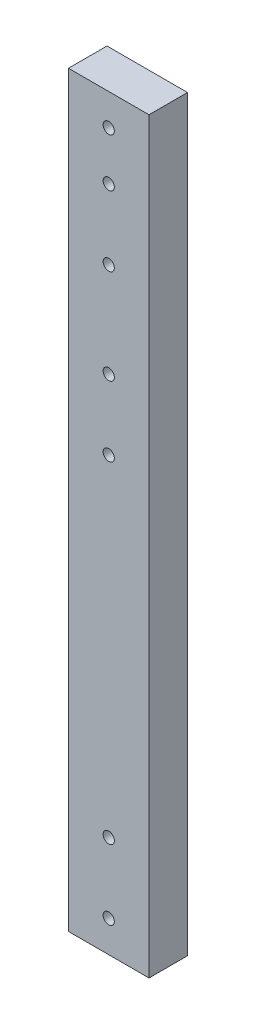
ISO-10303-21;
HEADER;
FILE_DESCRIPTION(('STEP AP214'),'2;1');
FILE_NAME('part.step','',(''),(''),'','','');
FILE_SCHEMA(('AUTOMOTIVE_DESIGN { 1 0 10303 214 1 1 1 1 }'));
ENDSEC;
DATA;
#1=APPLICATION_CONTEXT('core data for automotive mechanical design processes');
#2=APPLICATION_PROTOCOL_DEFINITION('international standard','automotive_design',2000,#1);
#3=PRODUCT_CONTEXT('',#1,'mechanical');
#4=PRODUCT('Part','Part','',(#3));
#5=PRODUCT_RELATED_PRODUCT_CATEGORY('part','',(#4));
#6=PRODUCT_DEFINITION_FORMATION('','',#4);
#7=PRODUCT_DEFINITION_CONTEXT('part definition',#1,'design');
#8=PRODUCT_DEFINITION('design','',#6,#7);
#9=PRODUCT_DEFINITION_SHAPE('','',#8);
#10=(LENGTH_UNIT() NAMED_UNIT(*) SI_UNIT(.MILLI.,.METRE.));
#11=(NAMED_UNIT(*) PLANE_ANGLE_UNIT() SI_UNIT($,.RADIAN.));
#12=(NAMED_UNIT(*) SI_UNIT($,.STERADIAN.) SOLID_ANGLE_UNIT());
#13=UNCERTAINTY_MEASURE_WITH_UNIT(LENGTH_MEASURE(1.E-05),#10,'distance_accuracy_value','');
#14=(GEOMETRIC_REPRESENTATION_CONTEXT(3) GLOBAL_UNCERTAINTY_ASSIGNED_CONTEXT((#13)) GLOBAL_UNIT_ASSIGNED_CONTEXT((#10,
#11,#12)) REPRESENTATION_CONTEXT('',''));
#15=CARTESIAN_POINT('',(0.,0.,0.));
#16=DIRECTION('',(0.,0.,1.));
#17=DIRECTION('',(1.,0.,0.));
#18=AXIS2_PLACEMENT_3D('',#15,#16,#17);
#19=CARTESIAN_POINT('',(0.,0.,9.));
#20=DIRECTION('',(0.,0.,1.));
#21=DIRECTION('',(1.,0.,0.));
#22=AXIS2_PLACEMENT_3D('',#19,#20,#21);
#23=PLANE('',#22);
#24=CARTESIAN_POINT('',(0.,29.6000000000001,9.));
#25=DIRECTION('',(0.,0.,1.));
#26=DIRECTION('',(1.,0.,0.));
#27=AXIS2_PLACEMENT_3D('',#24,#25,#26);
#28=CIRCLE('',#27,1.6);
#29=CARTESIAN_POINT('',(1.60000000000003,29.6000000000001,9.));
#30=VERTEX_POINT('',#29);
#31=EDGE_CURVE('E195',#30,#30,#28,.T.);
#32=ORIENTED_EDGE('',*,*,#31,.F.);
#33=EDGE_LOOP('',(#32));
#34=FACE_BOUND('',#33,.T.);
#35=CARTESIAN_POINT('',(0.,76.66,9.));
#36=DIRECTION('',(0.,0.,1.));
#37=DIRECTION('',(1.,0.,0.));
#38=AXIS2_PLACEMENT_3D('',#35,#36,#37);
#39=CIRCLE('',#38,1.6);
#40=CARTESIAN_POINT('',(1.6,76.66,9.));
#41=VERTEX_POINT('',#40);
#42=EDGE_CURVE('E211',#41,#41,#39,.T.);
#43=ORIENTED_EDGE('',*,*,#42,.F.);
#44=EDGE_LOOP('',(#43));
#45=FACE_BOUND('',#44,.T.);
#46=CARTESIAN_POINT('',(0.,-85.,9.));
#47=DIRECTION('',(0.,0.,1.));
#48=DIRECTION('',(1.,0.,0.));
#49=AXIS2_PLACEMENT_3D('',#46,#47,#48);
#50=CIRCLE('',#49,1.60000000000001);
#51=CARTESIAN_POINT('',(1.60000000000001,-85.,9.));
#52=VERTEX_POINT('',#51);
#53=EDGE_CURVE('E227',#52,#52,#50,.T.);
#54=ORIENTED_EDGE('',*,*,#53,.F.);
#55=EDGE_LOOP('',(#54));
#56=FACE_BOUND('',#55,.T.);
#57=DIRECTION('',(0.,1.,0.));
#58=VECTOR('',#57,1.);
#59=CARTESIAN_POINT('',(11.5,-114.,9.));
#60=LINE('',#59,#58);
#61=CARTESIAN_POINT('',(11.5,-114.,9.));
#62=VERTEX_POINT('',#61);
#63=CARTESIAN_POINT('',(11.5,99.5,9.));
#64=VERTEX_POINT('',#63);
#65=EDGE_CURVE('E239',#62,#64,#60,.T.);
#66=ORIENTED_EDGE('',*,*,#65,.T.);
#67=DIRECTION('',(-1.,0.,0.));
#68=VECTOR('',#67,1.);
#69=CARTESIAN_POINT('',(11.5,99.5,9.));
#70=LINE('',#69,#68);
#71=CARTESIAN_POINT('',(-11.5,99.5,9.));
#72=VERTEX_POINT('',#71);
#73=EDGE_CURVE('E246',#64,#72,#70,.T.);
#74=ORIENTED_EDGE('',*,*,#73,.T.);
#75=DIRECTION('',(0.,-1.,0.));
#76=VECTOR('',#75,1.);
#77=CARTESIAN_POINT('',(-11.5,99.5,9.));
#78=LINE('',#77,#76);
#79=CARTESIAN_POINT('',(-11.5,-114.,9.));
#80=VERTEX_POINT('',#79);
#81=EDGE_CURVE('E249',#72,#80,#78,.T.);
#82=ORIENTED_EDGE('',*,*,#81,.T.);
#83=DIRECTION('',(1.,0.,0.));
#84=VECTOR('',#83,1.);
#85=CARTESIAN_POINT('',(-11.5,-114.,9.));
#86=LINE('',#85,#84);
#87=EDGE_CURVE('E252',#80,#62,#86,.T.);
#88=ORIENTED_EDGE('',*,*,#87,.T.);
#89=EDGE_LOOP('',(#66,#74,#82,#88));
#90=FACE_BOUND('',#89,.T.);
#91=CARTESIAN_POINT('',(0.,-105.,9.));
#92=DIRECTION('',(0.,0.,1.));
#93=DIRECTION('',(1.,0.,0.));
#94=AXIS2_PLACEMENT_3D('',#91,#92,#93);
#95=CIRCLE('',#94,1.60000000000001);
#96=CARTESIAN_POINT('',(1.60000000000001,-105.,9.));
#97=VERTEX_POINT('',#96);
#98=EDGE_CURVE('E235',#97,#97,#95,.T.);
#99=ORIENTED_EDGE('',*,*,#98,.F.);
#100=EDGE_LOOP('',(#99));
#101=FACE_BOUND('',#100,.T.);
#102=CARTESIAN_POINT('',(0.,90.5,9.));
#103=DIRECTION('',(0.,0.,1.));
#104=DIRECTION('',(1.,0.,0.));
#105=AXIS2_PLACEMENT_3D('',#102,#103,#104);
#106=CIRCLE('',#105,1.6);
#107=CARTESIAN_POINT('',(1.6,90.5,9.));
#108=VERTEX_POINT('',#107);
#109=EDGE_CURVE('E219',#108,#108,#106,.T.);
#110=ORIENTED_EDGE('',*,*,#109,.F.);
#111=EDGE_LOOP('',(#110));
#112=FACE_BOUND('',#111,.T.);
#113=CARTESIAN_POINT('',(0.,56.66,9.));
#114=DIRECTION('',(0.,0.,1.));
#115=DIRECTION('',(1.,0.,0.));
#116=AXIS2_PLACEMENT_3D('',#113,#114,#115);
#117=CIRCLE('',#116,1.6);
#118=CARTESIAN_POINT('',(1.6,56.66,9.));
#119=VERTEX_POINT('',#118);
#120=EDGE_CURVE('E203',#119,#119,#117,.T.);
#121=ORIENTED_EDGE('',*,*,#120,.F.);
#122=EDGE_LOOP('',(#121));
#123=FACE_BOUND('',#122,.T.);
#124=CARTESIAN_POINT('',(0.,9.60000000000005,9.));
#125=DIRECTION('',(0.,0.,1.));
#126=DIRECTION('',(1.,0.,0.));
#127=AXIS2_PLACEMENT_3D('',#124,#125,#126);
#128=CIRCLE('',#127,1.6);
#129=CARTESIAN_POINT('',(1.60000000000005,9.60000000000005,9.));
#130=VERTEX_POINT('',#129);
#131=EDGE_CURVE('E187',#130,#130,#128,.T.);
#132=ORIENTED_EDGE('',*,*,#131,.F.);
#133=EDGE_LOOP('',(#132));
#134=FACE_BOUND('',#133,.T.);
#135=ADVANCED_FACE('F47',(#34,#45,#56,#90,#101,#112,#123,#134),#23,.T.);
#136=CARTESIAN_POINT('',(0.,0.,5.));
#137=DIRECTION('',(0.,0.,1.));
#138=DIRECTION('',(1.,0.,0.));
#139=AXIS2_PLACEMENT_3D('',#136,#137,#138);
#140=PLANE('',#139);
#141=DIRECTION('',(0.,-1.,0.));
#142=VECTOR('',#141,1.);
#143=CARTESIAN_POINT('',(7.65,95.65,5.));
#144=LINE('',#143,#142);
#145=CARTESIAN_POINT('',(7.65,95.65,5.));
#146=VERTEX_POINT('',#145);
#147=CARTESIAN_POINT('',(7.65,-110.15,5.));
#148=VERTEX_POINT('',#147);
#149=EDGE_CURVE('E152',#146,#148,#144,.T.);
#150=ORIENTED_EDGE('',*,*,#149,.T.);
#151=DIRECTION('',(-1.,0.,0.));
#152=VECTOR('',#151,1.);
#153=CARTESIAN_POINT('',(7.65,-110.15,5.));
#154=LINE('',#153,#152);
#155=CARTESIAN_POINT('',(-7.65,-110.15,5.));
#156=VERTEX_POINT('',#155);
#157=EDGE_CURVE('E132',#148,#156,#154,.T.);
#158=ORIENTED_EDGE('',*,*,#157,.T.);
#159=DIRECTION('',(0.,1.,0.));
#160=VECTOR('',#159,1.);
#161=CARTESIAN_POINT('',(-7.65,-110.15,5.));
#162=LINE('',#161,#160);
#163=CARTESIAN_POINT('',(-7.65,95.65,5.));
#164=VERTEX_POINT('',#163);
#165=EDGE_CURVE('E141',#156,#164,#162,.T.);
#166=ORIENTED_EDGE('',*,*,#165,.T.);
#167=DIRECTION('',(1.,0.,0.));
#168=VECTOR('',#167,1.);
#169=CARTESIAN_POINT('',(-7.65,95.65,5.));
#170=LINE('',#169,#168);
#171=EDGE_CURVE('E147',#164,#146,#170,.T.);
#172=ORIENTED_EDGE('',*,*,#171,.T.);
#173=EDGE_LOOP('',(#150,#158,#166,#172));
#174=FACE_BOUND('',#173,.T.);
#175=CARTESIAN_POINT('',(0.,-105.,5.));
#176=DIRECTION('',(0.,0.,1.));
#177=DIRECTION('',(1.,0.,0.));
#178=AXIS2_PLACEMENT_3D('',#175,#176,#177);
#179=CIRCLE('',#178,1.60000000000001);
#180=CARTESIAN_POINT('',(1.60000000000001,-105.,5.));
#181=VERTEX_POINT('',#180);
#182=EDGE_CURVE('E231',#181,#181,#179,.T.);
#183=ORIENTED_EDGE('',*,*,#182,.T.);
#184=EDGE_LOOP('',(#183));
#185=FACE_BOUND('',#184,.T.);
#186=CARTESIAN_POINT('',(0.,-85.,5.));
#187=DIRECTION('',(0.,0.,1.));
#188=DIRECTION('',(1.,0.,0.));
#189=AXIS2_PLACEMENT_3D('',#186,#187,#188);
#190=CIRCLE('',#189,1.60000000000001);
#191=CARTESIAN_POINT('',(1.60000000000001,-85.,5.));
#192=VERTEX_POINT('',#191);
#193=EDGE_CURVE('E223',#192,#192,#190,.T.);
#194=ORIENTED_EDGE('',*,*,#193,.T.);
#195=EDGE_LOOP('',(#194));
#196=FACE_BOUND('',#195,.T.);
#197=CARTESIAN_POINT('',(0.,90.5,5.));
#198=DIRECTION('',(0.,0.,1.));
#199=DIRECTION('',(1.,0.,0.));
#200=AXIS2_PLACEMENT_3D('',#197,#198,#199);
#201=CIRCLE('',#200,1.6);
#202=CARTESIAN_POINT('',(1.6,90.5,5.));
#203=VERTEX_POINT('',#202);
#204=EDGE_CURVE('E215',#203,#203,#201,.T.);
#205=ORIENTED_EDGE('',*,*,#204,.T.);
#206=EDGE_LOOP('',(#205));
#207=FACE_BOUND('',#206,.T.);
#208=CARTESIAN_POINT('',(0.,76.66,5.));
#209=DIRECTION('',(0.,0.,1.));
#210=DIRECTION('',(1.,0.,0.));
#211=AXIS2_PLACEMENT_3D('',#208,#209,#210);
#212=CIRCLE('',#211,1.6);
#213=CARTESIAN_POINT('',(1.6,76.66,5.));
#214=VERTEX_POINT('',#213);
#215=EDGE_CURVE('E207',#214,#214,#212,.T.);
#216=ORIENTED_EDGE('',*,*,#215,.T.);
#217=EDGE_LOOP('',(#216));
#218=FACE_BOUND('',#217,.T.);
#219=CARTESIAN_POINT('',(0.,56.66,5.));
#220=DIRECTION('',(0.,0.,1.));
#221=DIRECTION('',(1.,0.,0.));
#222=AXIS2_PLACEMENT_3D('',#219,#220,#221);
#223=CIRCLE('',#222,1.6);
#224=CARTESIAN_POINT('',(1.6,56.66,5.));
#225=VERTEX_POINT('',#224);
#226=EDGE_CURVE('E199',#225,#225,#223,.T.);
#227=ORIENTED_EDGE('',*,*,#226,.T.);
#228=EDGE_LOOP('',(#227));
#229=FACE_BOUND('',#228,.T.);
#230=CARTESIAN_POINT('',(0.,29.6000000000001,5.));
#231=DIRECTION('',(0.,0.,1.));
#232=DIRECTION('',(1.,0.,0.));
#233=AXIS2_PLACEMENT_3D('',#230,#231,#232);
#234=CIRCLE('',#233,1.6);
#235=CARTESIAN_POINT('',(1.60000000000003,29.6000000000001,5.));
#236=VERTEX_POINT('',#235);
#237=EDGE_CURVE('E191',#236,#236,#234,.T.);
#238=ORIENTED_EDGE('',*,*,#237,.T.);
#239=EDGE_LOOP('',(#238));
#240=FACE_BOUND('',#239,.T.);
#241=CARTESIAN_POINT('',(0.,9.60000000000005,5.));
#242=DIRECTION('',(0.,0.,1.));
#243=DIRECTION('',(1.,0.,0.));
#244=AXIS2_PLACEMENT_3D('',#241,#242,#243);
#245=CIRCLE('',#244,1.6);
#246=CARTESIAN_POINT('',(1.60000000000005,9.60000000000005,5.));
#247=VERTEX_POINT('',#246);
#248=EDGE_CURVE('E186',#247,#247,#245,.T.);
#249=ORIENTED_EDGE('',*,*,#248,.T.);
#250=EDGE_LOOP('',(#249));
#251=FACE_BOUND('',#250,.T.);
#252=ADVANCED_FACE('F149',(#174,#185,#196,#207,#218,#229,#240,#251),#140,.F.);
#253=CARTESIAN_POINT('',(11.5,-114.,9.));
#254=DIRECTION('',(-1.,0.,0.));
#255=DIRECTION('',(0.,0.,1.));
#256=AXIS2_PLACEMENT_3D('',#253,#254,#255);
#257=PLANE('',#256);
#258=DIRECTION('',(0.,0.,-1.));
#259=VECTOR('',#258,1.);
#260=CARTESIAN_POINT('',(11.5,-114.,9.));
#261=LINE('',#260,#259);
#262=CARTESIAN_POINT('',(11.5,-114.,-2.));
#263=VERTEX_POINT('',#262);
#264=EDGE_CURVE('E255',#62,#263,#261,.T.);
#265=ORIENTED_EDGE('',*,*,#264,.T.);
#266=DIRECTION('',(0.,-1.,0.));
#267=VECTOR('',#266,1.);
#268=CARTESIAN_POINT('',(11.5,99.5,-2.));
#269=LINE('',#268,#267);
#270=CARTESIAN_POINT('',(11.5,99.5,-2.));
#271=VERTEX_POINT('',#270);
#272=EDGE_CURVE('E174',#271,#263,#269,.T.);
#273=ORIENTED_EDGE('',*,*,#272,.F.);
#274=DIRECTION('',(0.,0.,-1.));
#275=VECTOR('',#274,1.);
#276=CARTESIAN_POINT('',(11.5,99.5,9.));
#277=LINE('',#276,#275);
#278=EDGE_CURVE('E264',#64,#271,#277,.T.);
#279=ORIENTED_EDGE('',*,*,#278,.F.);
#280=ORIENTED_EDGE('',*,*,#65,.F.);
#281=EDGE_LOOP('',(#265,#273,#279,#280));
#282=FACE_BOUND('',#281,.T.);
#283=ADVANCED_FACE('F324',(#282),#257,.F.);
#284=CARTESIAN_POINT('',(11.5,99.5,9.));
#285=DIRECTION('',(0.,-1.,0.));
#286=DIRECTION('',(0.,0.,-1.));
#287=AXIS2_PLACEMENT_3D('',#284,#285,#286);
#288=PLANE('',#287);
#289=ORIENTED_EDGE('',*,*,#278,.T.);
#290=DIRECTION('',(1.,0.,0.));
#291=VECTOR('',#290,1.);
#292=CARTESIAN_POINT('',(-11.5,99.5,-2.));
#293=LINE('',#292,#291);
#294=CARTESIAN_POINT('',(-11.5,99.5,-2.));
#295=VERTEX_POINT('',#294);
#296=EDGE_CURVE('E137',#295,#271,#293,.T.);
#297=ORIENTED_EDGE('',*,*,#296,.F.);
#298=DIRECTION('',(0.,0.,-1.));
#299=VECTOR('',#298,1.);
#300=CARTESIAN_POINT('',(-11.5,99.5,9.));
#301=LINE('',#300,#299);
#302=EDGE_CURVE('E261',#72,#295,#301,.T.);
#303=ORIENTED_EDGE('',*,*,#302,.F.);
#304=ORIENTED_EDGE('',*,*,#73,.F.);
#305=EDGE_LOOP('',(#289,#297,#303,#304));
#306=FACE_BOUND('',#305,.T.);
#307=ADVANCED_FACE('F339',(#306),#288,.F.);
#308=CARTESIAN_POINT('',(-11.5,99.5,9.));
#309=DIRECTION('',(1.,0.,0.));
#310=DIRECTION('',(0.,0.,-1.));
#311=AXIS2_PLACEMENT_3D('',#308,#309,#310);
#312=PLANE('',#311);
#313=ORIENTED_EDGE('',*,*,#302,.T.);
#314=DIRECTION('',(0.,1.,0.));
#315=VECTOR('',#314,1.);
#316=CARTESIAN_POINT('',(-11.5,-114.,-2.));
#317=LINE('',#316,#315);
#318=CARTESIAN_POINT('',(-11.5,-114.,-2.));
#319=VERTEX_POINT('',#318);
#320=EDGE_CURVE('E182',#319,#295,#317,.T.);
#321=ORIENTED_EDGE('',*,*,#320,.F.);
#322=DIRECTION('',(0.,0.,-1.));
#323=VECTOR('',#322,1.);
#324=CARTESIAN_POINT('',(-11.5,-114.,9.));
#325=LINE('',#324,#323);
#326=EDGE_CURVE('E258',#80,#319,#325,.T.);
#327=ORIENTED_EDGE('',*,*,#326,.F.);
#328=ORIENTED_EDGE('',*,*,#81,.F.);
#329=EDGE_LOOP('',(#313,#321,#327,#328));
#330=FACE_BOUND('',#329,.T.);
#331=ADVANCED_FACE('F335',(#330),#312,.F.);
#332=CARTESIAN_POINT('',(-11.5,-114.,9.));
#333=DIRECTION('',(0.,1.,0.));
#334=DIRECTION('',(0.,0.,1.));
#335=AXIS2_PLACEMENT_3D('',#332,#333,#334);
#336=PLANE('',#335);
#337=ORIENTED_EDGE('',*,*,#326,.T.);
#338=DIRECTION('',(-1.,0.,0.));
#339=VECTOR('',#338,1.);
#340=CARTESIAN_POINT('',(11.5,-114.,-2.));
#341=LINE('',#340,#339);
#342=EDGE_CURVE('E178',#263,#319,#341,.T.);
#343=ORIENTED_EDGE('',*,*,#342,.F.);
#344=ORIENTED_EDGE('',*,*,#264,.F.);
#345=ORIENTED_EDGE('',*,*,#87,.F.);
#346=EDGE_LOOP('',(#337,#343,#344,#345));
#347=FACE_BOUND('',#346,.T.);
#348=ADVANCED_FACE('F332',(#347),#336,.F.);
#349=CARTESIAN_POINT('',(0.,-105.,9.));
#350=DIRECTION('',(0.,0.,-1.));
#351=DIRECTION('',(-1.,0.,0.));
#352=AXIS2_PLACEMENT_3D('',#349,#350,#351);
#353=CYLINDRICAL_SURFACE('',#352,1.60000000000001);
#354=ORIENTED_EDGE('',*,*,#98,.T.);
#355=EDGE_LOOP('',(#354));
#356=FACE_BOUND('',#355,.T.);
#357=ORIENTED_EDGE('',*,*,#182,.F.);
#358=EDGE_LOOP('',(#357));
#359=FACE_BOUND('',#358,.T.);
#360=ADVANCED_FACE('F329',(#356,#359),#353,.F.);
#361=CARTESIAN_POINT('',(0.,-85.,9.));
#362=DIRECTION('',(0.,0.,-1.));
#363=DIRECTION('',(-1.,0.,0.));
#364=AXIS2_PLACEMENT_3D('',#361,#362,#363);
#365=CYLINDRICAL_SURFACE('',#364,1.60000000000001);
#366=ORIENTED_EDGE('',*,*,#53,.T.);
#367=EDGE_LOOP('',(#366));
#368=FACE_BOUND('',#367,.T.);
#369=ORIENTED_EDGE('',*,*,#193,.F.);
#370=EDGE_LOOP('',(#369));
#371=FACE_BOUND('',#370,.T.);
#372=ADVANCED_FACE('F485',(#368,#371),#365,.F.);
#373=CARTESIAN_POINT('',(0.,90.5,9.));
#374=DIRECTION('',(0.,0.,-1.));
#375=DIRECTION('',(-1.,0.,0.));
#376=AXIS2_PLACEMENT_3D('',#373,#374,#375);
#377=CYLINDRICAL_SURFACE('',#376,1.6);
#378=ORIENTED_EDGE('',*,*,#109,.T.);
#379=EDGE_LOOP('',(#378));
#380=FACE_BOUND('',#379,.T.);
#381=ORIENTED_EDGE('',*,*,#204,.F.);
#382=EDGE_LOOP('',(#381));
#383=FACE_BOUND('',#382,.T.);
#384=ADVANCED_FACE('F475',(#380,#383),#377,.F.);
#385=CARTESIAN_POINT('',(0.,76.66,9.));
#386=DIRECTION('',(0.,0.,-1.));
#387=DIRECTION('',(-1.,0.,0.));
#388=AXIS2_PLACEMENT_3D('',#385,#386,#387);
#389=CYLINDRICAL_SURFACE('',#388,1.6);
#390=ORIENTED_EDGE('',*,*,#42,.T.);
#391=EDGE_LOOP('',(#390));
#392=FACE_BOUND('',#391,.T.);
#393=ORIENTED_EDGE('',*,*,#215,.F.);
#394=EDGE_LOOP('',(#393));
#395=FACE_BOUND('',#394,.T.);
#396=ADVANCED_FACE('F465',(#392,#395),#389,.F.);
#397=CARTESIAN_POINT('',(0.,56.66,9.));
#398=DIRECTION('',(0.,0.,-1.));
#399=DIRECTION('',(-1.,0.,0.));
#400=AXIS2_PLACEMENT_3D('',#397,#398,#399);
#401=CYLINDRICAL_SURFACE('',#400,1.6);
#402=ORIENTED_EDGE('',*,*,#120,.T.);
#403=EDGE_LOOP('',(#402));
#404=FACE_BOUND('',#403,.T.);
#405=ORIENTED_EDGE('',*,*,#226,.F.);
#406=EDGE_LOOP('',(#405));
#407=FACE_BOUND('',#406,.T.);
#408=ADVANCED_FACE('F455',(#404,#407),#401,.F.);
#409=CARTESIAN_POINT('',(0.,29.6000000000001,9.));
#410=DIRECTION('',(0.,0.,-1.));
#411=DIRECTION('',(-1.,0.,0.));
#412=AXIS2_PLACEMENT_3D('',#409,#410,#411);
#413=CYLINDRICAL_SURFACE('',#412,1.6);
#414=ORIENTED_EDGE('',*,*,#31,.T.);
#415=EDGE_LOOP('',(#414));
#416=FACE_BOUND('',#415,.T.);
#417=ORIENTED_EDGE('',*,*,#237,.F.);
#418=EDGE_LOOP('',(#417));
#419=FACE_BOUND('',#418,.T.);
#420=ADVANCED_FACE('F445',(#416,#419),#413,.F.);
#421=CARTESIAN_POINT('',(0.,9.60000000000005,9.));
#422=DIRECTION('',(0.,0.,-1.));
#423=DIRECTION('',(-1.,0.,0.));
#424=AXIS2_PLACEMENT_3D('',#421,#422,#423);
#425=CYLINDRICAL_SURFACE('',#424,1.6);
#426=ORIENTED_EDGE('',*,*,#131,.T.);
#427=EDGE_LOOP('',(#426));
#428=FACE_BOUND('',#427,.T.);
#429=ORIENTED_EDGE('',*,*,#248,.F.);
#430=EDGE_LOOP('',(#429));
#431=FACE_BOUND('',#430,.T.);
#432=ADVANCED_FACE('F401',(#428,#431),#425,.F.);
#433=CARTESIAN_POINT('',(0.,0.,-2.));
#434=DIRECTION('',(0.,0.,-1.));
#435=DIRECTION('',(-1.,0.,0.));
#436=AXIS2_PLACEMENT_3D('',#433,#434,#435);
#437=PLANE('',#436);
#438=DIRECTION('',(0.,-1.,0.));
#439=VECTOR('',#438,1.);
#440=CARTESIAN_POINT('',(-9.65,0.,-2.));
#441=LINE('',#440,#439);
#442=CARTESIAN_POINT('',(-9.65,97.65,-2.));
#443=VERTEX_POINT('',#442);
#444=CARTESIAN_POINT('',(-9.65,-112.15,-2.));
#445=VERTEX_POINT('',#444);
#446=EDGE_CURVE('E275',#443,#445,#441,.T.);
#447=ORIENTED_EDGE('',*,*,#446,.T.);
#448=DIRECTION('',(1.,0.,0.));
#449=VECTOR('',#448,1.);
#450=CARTESIAN_POINT('',(0.,-112.15,-2.));
#451=LINE('',#450,#449);
#452=CARTESIAN_POINT('',(9.65,-112.15,-2.));
#453=VERTEX_POINT('',#452);
#454=EDGE_CURVE('E278',#445,#453,#451,.T.);
#455=ORIENTED_EDGE('',*,*,#454,.T.);
#456=DIRECTION('',(0.,1.,0.));
#457=VECTOR('',#456,1.);
#458=CARTESIAN_POINT('',(9.65,0.,-2.));
#459=LINE('',#458,#457);
#460=CARTESIAN_POINT('',(9.65,97.65,-2.));
#461=VERTEX_POINT('',#460);
#462=EDGE_CURVE('E269',#453,#461,#459,.T.);
#463=ORIENTED_EDGE('',*,*,#462,.T.);
#464=DIRECTION('',(-1.,0.,0.));
#465=VECTOR('',#464,1.);
#466=CARTESIAN_POINT('',(0.,97.65,-2.));
#467=LINE('',#466,#465);
#468=EDGE_CURVE('E272',#461,#443,#467,.T.);
#469=ORIENTED_EDGE('',*,*,#468,.T.);
#470=EDGE_LOOP('',(#447,#455,#463,#469));
#471=FACE_BOUND('',#470,.T.);
#472=ORIENTED_EDGE('',*,*,#296,.T.);
#473=ORIENTED_EDGE('',*,*,#272,.T.);
#474=ORIENTED_EDGE('',*,*,#342,.T.);
#475=ORIENTED_EDGE('',*,*,#320,.T.);
#476=EDGE_LOOP('',(#472,#473,#474,#475));
#477=FACE_BOUND('',#476,.T.);
#478=ADVANCED_FACE('F392',(#471,#477),#437,.T.);
#479=CARTESIAN_POINT('',(7.65,-110.15,-2.));
#480=DIRECTION('',(0.,1.,0.));
#481=DIRECTION('',(0.,0.,1.));
#482=AXIS2_PLACEMENT_3D('',#479,#480,#481);
#483=PLANE('',#482);
#484=DIRECTION('',(0.,0.,1.));
#485=VECTOR('',#484,1.);
#486=CARTESIAN_POINT('',(7.65,-110.15,-2.));
#487=LINE('',#486,#485);
#488=CARTESIAN_POINT('',(7.65,-110.15,0.));
#489=VERTEX_POINT('',#488);
#490=EDGE_CURVE('E163',#489,#148,#487,.T.);
#491=ORIENTED_EDGE('',*,*,#490,.F.);
#492=DIRECTION('',(-1.,0.,0.));
#493=VECTOR('',#492,1.);
#494=CARTESIAN_POINT('',(7.65,-110.15,0.));
#495=LINE('',#494,#493);
#496=CARTESIAN_POINT('',(-7.65,-110.15,0.));
#497=VERTEX_POINT('',#496);
#498=EDGE_CURVE('E135',#489,#497,#495,.T.);
#499=ORIENTED_EDGE('',*,*,#498,.T.);
#500=DIRECTION('',(0.,0.,1.));
#501=VECTOR('',#500,1.);
#502=CARTESIAN_POINT('',(-7.65,-110.15,-2.));
#503=LINE('',#502,#501);
#504=EDGE_CURVE('E127',#497,#156,#503,.T.);
#505=ORIENTED_EDGE('',*,*,#504,.T.);
#506=ORIENTED_EDGE('',*,*,#157,.F.);
#507=EDGE_LOOP('',(#491,#499,#505,#506));
#508=FACE_BOUND('',#507,.T.);
#509=ADVANCED_FACE('F130',(#508),#483,.T.);
#510=CARTESIAN_POINT('',(-7.65,-110.15,-2.));
#511=DIRECTION('',(1.,0.,0.));
#512=DIRECTION('',(0.,0.,-1.));
#513=AXIS2_PLACEMENT_3D('',#510,#511,#512);
#514=PLANE('',#513);
#515=ORIENTED_EDGE('',*,*,#504,.F.);
#516=DIRECTION('',(0.,1.,0.));
#517=VECTOR('',#516,1.);
#518=CARTESIAN_POINT('',(-7.65,-110.15,0.));
#519=LINE('',#518,#517);
#520=CARTESIAN_POINT('',(-7.65,95.65,0.));
#521=VERTEX_POINT('',#520);
#522=EDGE_CURVE('E73',#497,#521,#519,.T.);
#523=ORIENTED_EDGE('',*,*,#522,.T.);
#524=DIRECTION('',(0.,0.,1.));
#525=VECTOR('',#524,1.);
#526=CARTESIAN_POINT('',(-7.65,95.65,-2.));
#527=LINE('',#526,#525);
#528=EDGE_CURVE('E138',#521,#164,#527,.T.);
#529=ORIENTED_EDGE('',*,*,#528,.T.);
#530=ORIENTED_EDGE('',*,*,#165,.F.);
#531=EDGE_LOOP('',(#515,#523,#529,#530));
#532=FACE_BOUND('',#531,.T.);
#533=ADVANCED_FACE('F142',(#532),#514,.T.);
#534=CARTESIAN_POINT('',(-7.65,95.65,-2.));
#535=DIRECTION('',(0.,-1.,0.));
#536=DIRECTION('',(0.,0.,-1.));
#537=AXIS2_PLACEMENT_3D('',#534,#535,#536);
#538=PLANE('',#537);
#539=ORIENTED_EDGE('',*,*,#528,.F.);
#540=DIRECTION('',(1.,0.,0.));
#541=VECTOR('',#540,1.);
#542=CARTESIAN_POINT('',(-7.65,95.65,0.));
#543=LINE('',#542,#541);
#544=CARTESIAN_POINT('',(7.65,95.65,0.));
#545=VERTEX_POINT('',#544);
#546=EDGE_CURVE('E58',#521,#545,#543,.T.);
#547=ORIENTED_EDGE('',*,*,#546,.T.);
#548=DIRECTION('',(0.,0.,1.));
#549=VECTOR('',#548,1.);
#550=CARTESIAN_POINT('',(7.65,95.65,-2.));
#551=LINE('',#550,#549);
#552=EDGE_CURVE('E166',#545,#146,#551,.T.);
#553=ORIENTED_EDGE('',*,*,#552,.T.);
#554=ORIENTED_EDGE('',*,*,#171,.F.);
#555=EDGE_LOOP('',(#539,#547,#553,#554));
#556=FACE_BOUND('',#555,.T.);
#557=ADVANCED_FACE('F308',(#556),#538,.T.);
#558=CARTESIAN_POINT('',(7.65,95.65,-2.));
#559=DIRECTION('',(-1.,0.,0.));
#560=DIRECTION('',(0.,0.,1.));
#561=AXIS2_PLACEMENT_3D('',#558,#559,#560);
#562=PLANE('',#561);
#563=ORIENTED_EDGE('',*,*,#552,.F.);
#564=DIRECTION('',(0.,-1.,0.));
#565=VECTOR('',#564,1.);
#566=CARTESIAN_POINT('',(7.65,95.65,0.));
#567=LINE('',#566,#565);
#568=EDGE_CURVE('E11',#545,#489,#567,.T.);
#569=ORIENTED_EDGE('',*,*,#568,.T.);
#570=ORIENTED_EDGE('',*,*,#490,.T.);
#571=ORIENTED_EDGE('',*,*,#149,.F.);
#572=EDGE_LOOP('',(#563,#569,#570,#571));
#573=FACE_BOUND('',#572,.T.);
#574=ADVANCED_FACE('F307',(#573),#562,.T.);
#575=CARTESIAN_POINT('',(-7.65,95.65,0.));
#576=DIRECTION('',(0.,0.707106781186547,0.707106781186547));
#577=DIRECTION('',(1.,0.,0.));
#578=AXIS2_PLACEMENT_3D('',#575,#576,#577);
#579=PLANE('',#578);
#580=DIRECTION('',(-0.577350269189626,0.577350269189626,-0.577350269189626));
#581=VECTOR('',#580,1.);
#582=CARTESIAN_POINT('',(60.95,27.05,68.6));
#583=LINE('',#582,#581);
#584=EDGE_CURVE('E157',#443,#521,#583,.F.);
#585=ORIENTED_EDGE('',*,*,#584,.F.);
#586=ORIENTED_EDGE('',*,*,#468,.F.);
#587=DIRECTION('',(0.577350269189626,0.577350269189626,-0.577350269189626));
#588=VECTOR('',#587,1.);
#589=CARTESIAN_POINT('',(2.55,90.55,5.1));
#590=LINE('',#589,#588);
#591=EDGE_CURVE('E52',#545,#461,#590,.T.);
#592=ORIENTED_EDGE('',*,*,#591,.F.);
#593=ORIENTED_EDGE('',*,*,#546,.F.);
#594=EDGE_LOOP('',(#585,#586,#592,#593));
#595=FACE_BOUND('',#594,.T.);
#596=ADVANCED_FACE('F50',(#595),#579,.F.);
#597=CARTESIAN_POINT('',(7.65,95.65,0.));
#598=DIRECTION('',(0.707106781186547,0.,0.707106781186548));
#599=DIRECTION('',(0.,-1.,0.));
#600=AXIS2_PLACEMENT_3D('',#597,#598,#599);
#601=PLANE('',#600);
#602=ORIENTED_EDGE('',*,*,#591,.T.);
#603=ORIENTED_EDGE('',*,*,#462,.F.);
#604=DIRECTION('',(-0.577350269189626,0.577350269189626,0.577350269189626));
#605=VECTOR('',#604,1.);
#606=CARTESIAN_POINT('',(7.65,-110.15,0.));
#607=LINE('',#606,#605);
#608=EDGE_CURVE('E289',#489,#453,#607,.F.);
#609=ORIENTED_EDGE('',*,*,#608,.F.);
#610=ORIENTED_EDGE('',*,*,#568,.F.);
#611=EDGE_LOOP('',(#602,#603,#609,#610));
#612=FACE_BOUND('',#611,.T.);
#613=ADVANCED_FACE('F305',(#612),#601,.F.);
#614=CARTESIAN_POINT('',(-7.65,-110.15,0.));
#615=DIRECTION('',(-0.707106781186547,0.,0.707106781186548));
#616=DIRECTION('',(0.,1.,0.));
#617=AXIS2_PLACEMENT_3D('',#614,#615,#616);
#618=PLANE('',#617);
#619=ORIENTED_EDGE('',*,*,#584,.T.);
#620=ORIENTED_EDGE('',*,*,#522,.F.);
#621=DIRECTION('',(-0.577350269189626,-0.577350269189626,-0.577350269189626));
#622=VECTOR('',#621,1.);
#623=CARTESIAN_POINT('',(-2.55,-105.05,5.1));
#624=LINE('',#623,#622);
#625=EDGE_CURVE('E286',#445,#497,#624,.F.);
#626=ORIENTED_EDGE('',*,*,#625,.F.);
#627=ORIENTED_EDGE('',*,*,#446,.F.);
#628=EDGE_LOOP('',(#619,#620,#626,#627));
#629=FACE_BOUND('',#628,.T.);
#630=ADVANCED_FACE('F296',(#629),#618,.F.);
#631=CARTESIAN_POINT('',(7.65,-110.15,0.));
#632=DIRECTION('',(0.,-0.707106781186547,0.707106781186547));
#633=DIRECTION('',(-1.,0.,0.));
#634=AXIS2_PLACEMENT_3D('',#631,#632,#633);
#635=PLANE('',#634);
#636=ORIENTED_EDGE('',*,*,#608,.T.);
#637=ORIENTED_EDGE('',*,*,#454,.F.);
#638=ORIENTED_EDGE('',*,*,#625,.T.);
#639=ORIENTED_EDGE('',*,*,#498,.F.);
#640=EDGE_LOOP('',(#636,#637,#638,#639));
#641=FACE_BOUND('',#640,.T.);
#642=ADVANCED_FACE('F348',(#641),#635,.F.);
#643=CLOSED_SHELL('',(#135,#252,#283,#307,#331,#348,#360,#372,#384,#396,#408,#420,#432,#478,
#509,#533,#557,#574,#596,#613,#630,#642));
#644=MANIFOLD_SOLID_BREP('B2',#643);
#645=ADVANCED_BREP_SHAPE_REPRESENTATION('',(#18,#644),#14);
#646=SHAPE_DEFINITION_REPRESENTATION(#9,#645);
ENDSEC;
END-ISO-10303-21;
